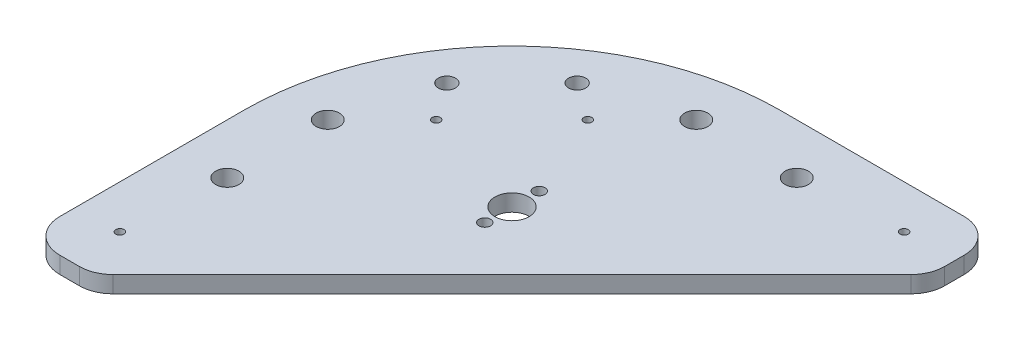
ISO-10303-21;
HEADER;
FILE_DESCRIPTION(('STEP AP214'),'2;1');
FILE_NAME('part.step','',(''),(''),'','','');
FILE_SCHEMA(('AUTOMOTIVE_DESIGN { 1 0 10303 214 1 1 1 1 }'));
ENDSEC;
DATA;
#1=APPLICATION_CONTEXT('core data for automotive mechanical design processes');
#2=APPLICATION_PROTOCOL_DEFINITION('international standard','automotive_design',2000,#1);
#3=PRODUCT_CONTEXT('',#1,'mechanical');
#4=PRODUCT('Part','Part','',(#3));
#5=PRODUCT_RELATED_PRODUCT_CATEGORY('part','',(#4));
#6=PRODUCT_DEFINITION_FORMATION('','',#4);
#7=PRODUCT_DEFINITION_CONTEXT('part definition',#1,'design');
#8=PRODUCT_DEFINITION('design','',#6,#7);
#9=PRODUCT_DEFINITION_SHAPE('','',#8);
#10=(LENGTH_UNIT() NAMED_UNIT(*) SI_UNIT(.MILLI.,.METRE.));
#11=(NAMED_UNIT(*) PLANE_ANGLE_UNIT() SI_UNIT($,.RADIAN.));
#12=(NAMED_UNIT(*) SI_UNIT($,.STERADIAN.) SOLID_ANGLE_UNIT());
#13=UNCERTAINTY_MEASURE_WITH_UNIT(LENGTH_MEASURE(1.E-05),#10,'distance_accuracy_value','');
#14=(GEOMETRIC_REPRESENTATION_CONTEXT(3) GLOBAL_UNCERTAINTY_ASSIGNED_CONTEXT((#13)) GLOBAL_UNIT_ASSIGNED_CONTEXT((#10,
#11,#12)) REPRESENTATION_CONTEXT('',''));
#15=CARTESIAN_POINT('',(0.,0.,0.));
#16=DIRECTION('',(0.,0.,1.));
#17=DIRECTION('',(1.,0.,0.));
#18=AXIS2_PLACEMENT_3D('',#15,#16,#17);
#19=CARTESIAN_POINT('',(92.0750000000001,3.175,92.075));
#20=DIRECTION('',(-1.,0.,0.));
#21=DIRECTION('',(0.,0.,1.));
#22=AXIS2_PLACEMENT_3D('',#19,#20,#21);
#23=PLANE('',#22);
#24=DIRECTION('',(0.,0.,-1.));
#25=VECTOR('',#24,1.);
#26=CARTESIAN_POINT('',(92.0750000000001,-3.175,92.075));
#27=LINE('',#26,#25);
#28=CARTESIAN_POINT('',(92.0750000000001,-3.175,-71.9355122421383));
#29=VERTEX_POINT('',#28);
#30=CARTESIAN_POINT('',(92.0750000000001,-3.175,-79.375));
#31=VERTEX_POINT('',#30);
#32=EDGE_CURVE('E137',#29,#31,#27,.T.);
#33=ORIENTED_EDGE('',*,*,#32,.T.);
#34=DIRECTION('',(0.,-1.,0.));
#35=VECTOR('',#34,1.);
#36=CARTESIAN_POINT('',(92.0750000000001,3.175,-79.3750000000001));
#37=LINE('',#36,#35);
#38=CARTESIAN_POINT('',(92.0750000000001,3.175,-79.375));
#39=VERTEX_POINT('',#38);
#40=EDGE_CURVE('E123',#31,#39,#37,.F.);
#41=ORIENTED_EDGE('',*,*,#40,.T.);
#42=DIRECTION('',(0.,0.,-1.));
#43=VECTOR('',#42,1.);
#44=CARTESIAN_POINT('',(92.0750000000001,3.175,92.075));
#45=LINE('',#44,#43);
#46=CARTESIAN_POINT('',(92.0750000000001,3.175,-71.9355122421383));
#47=VERTEX_POINT('',#46);
#48=EDGE_CURVE('E146',#47,#39,#45,.T.);
#49=ORIENTED_EDGE('',*,*,#48,.F.);
#50=DIRECTION('',(0.,1.,0.));
#51=VECTOR('',#50,1.);
#52=CARTESIAN_POINT('',(92.0750000000001,3.175,-71.9355122421383));
#53=LINE('',#52,#51);
#54=EDGE_CURVE('E126',#47,#29,#53,.F.);
#55=ORIENTED_EDGE('',*,*,#54,.T.);
#56=EDGE_LOOP('',(#33,#41,#49,#55));
#57=FACE_BOUND('',#56,.T.);
#58=ADVANCED_FACE('F39',(#57),#23,.F.);
#59=CARTESIAN_POINT('',(-92.0749999999999,3.175,-92.075));
#60=DIRECTION('',(0.,0.,1.));
#61=DIRECTION('',(1.,0.,0.));
#62=AXIS2_PLACEMENT_3D('',#59,#60,#61);
#63=PLANE('',#62);
#64=DIRECTION('',(-1.,0.,0.));
#65=VECTOR('',#64,1.);
#66=CARTESIAN_POINT('',(-92.0749999999999,-3.175,-92.075));
#67=LINE('',#66,#65);
#68=CARTESIAN_POINT('',(79.3750000000001,-3.175,-92.075));
#69=VERTEX_POINT('',#68);
#70=CARTESIAN_POINT('',(9.52500000000005,-3.175,-92.075));
#71=VERTEX_POINT('',#70);
#72=EDGE_CURVE('E130',#69,#71,#67,.T.);
#73=ORIENTED_EDGE('',*,*,#72,.T.);
#74=DIRECTION('',(0.,-1.,0.));
#75=VECTOR('',#74,1.);
#76=CARTESIAN_POINT('',(9.52500000000005,3.175,-92.075));
#77=LINE('',#76,#75);
#78=CARTESIAN_POINT('',(9.52500000000005,3.175,-92.075));
#79=VERTEX_POINT('',#78);
#80=EDGE_CURVE('E48',#71,#79,#77,.F.);
#81=ORIENTED_EDGE('',*,*,#80,.T.);
#82=DIRECTION('',(-1.,0.,0.));
#83=VECTOR('',#82,1.);
#84=CARTESIAN_POINT('',(-92.0749999999999,3.175,-92.075));
#85=LINE('',#84,#83);
#86=CARTESIAN_POINT('',(79.3750000000001,3.175,-92.075));
#87=VERTEX_POINT('',#86);
#88=EDGE_CURVE('E131',#87,#79,#85,.T.);
#89=ORIENTED_EDGE('',*,*,#88,.F.);
#90=DIRECTION('',(0.,-1.,0.));
#91=VECTOR('',#90,1.);
#92=CARTESIAN_POINT('',(79.3750000000001,3.175,-92.075));
#93=LINE('',#92,#91);
#94=EDGE_CURVE('E122',#87,#69,#93,.T.);
#95=ORIENTED_EDGE('',*,*,#94,.T.);
#96=EDGE_LOOP('',(#73,#81,#89,#95));
#97=FACE_BOUND('',#96,.T.);
#98=ADVANCED_FACE('F129',(#97),#63,.F.);
#99=CARTESIAN_POINT('',(-92.0749999999999,3.175,92.075));
#100=DIRECTION('',(1.,0.,0.));
#101=DIRECTION('',(0.,0.,-1.));
#102=AXIS2_PLACEMENT_3D('',#99,#100,#101);
#103=PLANE('',#102);
#104=DIRECTION('',(0.,0.,1.));
#105=VECTOR('',#104,1.);
#106=CARTESIAN_POINT('',(-92.0749999999999,3.175,92.075));
#107=LINE('',#106,#105);
#108=CARTESIAN_POINT('',(-92.0749999999999,3.175,9.52499999999996));
#109=VERTEX_POINT('',#108);
#110=CARTESIAN_POINT('',(-92.0749999999999,3.175,79.375));
#111=VERTEX_POINT('',#110);
#112=EDGE_CURVE('E254',#109,#111,#107,.T.);
#113=ORIENTED_EDGE('',*,*,#112,.F.);
#114=DIRECTION('',(0.,-1.,0.));
#115=VECTOR('',#114,1.);
#116=CARTESIAN_POINT('',(-92.0749999999999,3.175,9.52499999999996));
#117=LINE('',#116,#115);
#118=CARTESIAN_POINT('',(-92.0749999999999,-3.175,9.52499999999996));
#119=VERTEX_POINT('',#118);
#120=EDGE_CURVE('E177',#109,#119,#117,.T.);
#121=ORIENTED_EDGE('',*,*,#120,.T.);
#122=DIRECTION('',(0.,0.,1.));
#123=VECTOR('',#122,1.);
#124=CARTESIAN_POINT('',(-92.0749999999999,-3.175,92.075));
#125=LINE('',#124,#123);
#126=CARTESIAN_POINT('',(-92.0749999999999,-3.175,79.375));
#127=VERTEX_POINT('',#126);
#128=EDGE_CURVE('E136',#119,#127,#125,.T.);
#129=ORIENTED_EDGE('',*,*,#128,.T.);
#130=DIRECTION('',(0.,-1.,0.));
#131=VECTOR('',#130,1.);
#132=CARTESIAN_POINT('',(-92.0749999999999,3.175,79.375));
#133=LINE('',#132,#131);
#134=EDGE_CURVE('E174',#127,#111,#133,.F.);
#135=ORIENTED_EDGE('',*,*,#134,.T.);
#136=EDGE_LOOP('',(#113,#121,#129,#135));
#137=FACE_BOUND('',#136,.T.);
#138=ADVANCED_FACE('F288',(#137),#103,.F.);
#139=CARTESIAN_POINT('',(-92.0749999999999,3.175,92.075));
#140=DIRECTION('',(0.,0.,-1.));
#141=DIRECTION('',(-1.,0.,0.));
#142=AXIS2_PLACEMENT_3D('',#139,#140,#141);
#143=PLANE('',#142);
#144=DIRECTION('',(1.,0.,0.));
#145=VECTOR('',#144,1.);
#146=CARTESIAN_POINT('',(-92.0749999999999,-3.175,92.075));
#147=LINE('',#146,#145);
#148=CARTESIAN_POINT('',(-79.3749999999999,-3.175,92.075));
#149=VERTEX_POINT('',#148);
#150=CARTESIAN_POINT('',(-71.9355122421382,-3.175,92.075));
#151=VERTEX_POINT('',#150);
#152=EDGE_CURVE('E139',#149,#151,#147,.T.);
#153=ORIENTED_EDGE('',*,*,#152,.T.);
#154=DIRECTION('',(0.,1.,0.));
#155=VECTOR('',#154,1.);
#156=CARTESIAN_POINT('',(-71.9355122421382,3.175,92.075));
#157=LINE('',#156,#155);
#158=CARTESIAN_POINT('',(-71.9355122421382,3.175,92.075));
#159=VERTEX_POINT('',#158);
#160=EDGE_CURVE('E171',#151,#159,#157,.T.);
#161=ORIENTED_EDGE('',*,*,#160,.T.);
#162=DIRECTION('',(1.,0.,0.));
#163=VECTOR('',#162,1.);
#164=CARTESIAN_POINT('',(-92.0749999999999,3.175,92.075));
#165=LINE('',#164,#163);
#166=CARTESIAN_POINT('',(-79.3749999999999,3.175,92.075));
#167=VERTEX_POINT('',#166);
#168=EDGE_CURVE('E133',#167,#159,#165,.T.);
#169=ORIENTED_EDGE('',*,*,#168,.F.);
#170=DIRECTION('',(0.,-1.,0.));
#171=VECTOR('',#170,1.);
#172=CARTESIAN_POINT('',(-79.3749999999999,3.175,92.075));
#173=LINE('',#172,#171);
#174=EDGE_CURVE('E168',#167,#149,#173,.T.);
#175=ORIENTED_EDGE('',*,*,#174,.T.);
#176=EDGE_LOOP('',(#153,#161,#169,#175));
#177=FACE_BOUND('',#176,.T.);
#178=ADVANCED_FACE('F263',(#177),#143,.F.);
#179=CARTESIAN_POINT('',(0.,3.175,0.));
#180=DIRECTION('',(0.,-1.,0.));
#181=DIRECTION('',(0.,0.,-1.));
#182=AXIS2_PLACEMENT_3D('',#179,#180,#181);
#183=PLANE('',#182);
#184=CARTESIAN_POINT('',(-37.8139406810139,3.175,-62.5096450139542));
#185=DIRECTION('',(0.,-1.,0.));
#186=DIRECTION('',(0.,0.,-1.));
#187=AXIS2_PLACEMENT_3D('',#184,#185,#186);
#188=CIRCLE('',#187,3.2639);
#189=CARTESIAN_POINT('',(-37.8139406810139,3.175,-65.7735450139542));
#190=VERTEX_POINT('',#189);
#191=EDGE_CURVE('E376',#190,#190,#188,.T.);
#192=ORIENTED_EDGE('',*,*,#191,.T.);
#193=EDGE_LOOP('',(#192));
#194=FACE_BOUND('',#193,.T.);
#195=CARTESIAN_POINT('',(-62.509645013954,3.175,-37.813940681014));
#196=DIRECTION('',(0.,-1.,0.));
#197=DIRECTION('',(0.,0.,-1.));
#198=AXIS2_PLACEMENT_3D('',#195,#196,#197);
#199=CIRCLE('',#198,3.2639);
#200=CARTESIAN_POINT('',(-62.509645013954,3.175,-41.077840681014));
#201=VERTEX_POINT('',#200);
#202=EDGE_CURVE('E384',#201,#201,#199,.T.);
#203=ORIENTED_EDGE('',*,*,#202,.T.);
#204=EDGE_LOOP('',(#203));
#205=FACE_BOUND('',#204,.T.);
#206=CARTESIAN_POINT('',(-75.6552561210691,3.175,73.025));
#207=DIRECTION('',(0.,-1.,0.));
#208=DIRECTION('',(0.,0.,-1.));
#209=AXIS2_PLACEMENT_3D('',#206,#207,#208);
#210=CIRCLE('',#209,1.53670000000001);
#211=CARTESIAN_POINT('',(-75.6552561210691,3.175,71.4883));
#212=VERTEX_POINT('',#211);
#213=EDGE_CURVE('E190',#212,#212,#210,.T.);
#214=ORIENTED_EDGE('',*,*,#213,.T.);
#215=EDGE_LOOP('',(#214));
#216=FACE_BOUND('',#215,.T.);
#217=CARTESIAN_POINT('',(-52.4684097937106,3.175,-23.7315902062894));
#218=DIRECTION('',(0.,-1.,0.));
#219=DIRECTION('',(0.,0.,-1.));
#220=AXIS2_PLACEMENT_3D('',#217,#218,#219);
#221=CIRCLE('',#220,1.53670000000001);
#222=CARTESIAN_POINT('',(-52.4684097937106,3.175,-25.2682902062894));
#223=VERTEX_POINT('',#222);
#224=EDGE_CURVE('E390',#223,#223,#221,.T.);
#225=ORIENTED_EDGE('',*,*,#224,.T.);
#226=EDGE_LOOP('',(#225));
#227=FACE_BOUND('',#226,.T.);
#228=CARTESIAN_POINT('',(73.0250000000001,3.175,-75.6552561210691));
#229=DIRECTION('',(0.,-1.,0.));
#230=DIRECTION('',(0.,0.,-1.));
#231=AXIS2_PLACEMENT_3D('',#228,#229,#230);
#232=CIRCLE('',#231,1.53670000000001);
#233=CARTESIAN_POINT('',(73.0250000000001,3.175,-77.1919561210691));
#234=VERTEX_POINT('',#233);
#235=EDGE_CURVE('E203',#234,#234,#232,.T.);
#236=ORIENTED_EDGE('',*,*,#235,.T.);
#237=EDGE_LOOP('',(#236));
#238=FACE_BOUND('',#237,.T.);
#239=CARTESIAN_POINT('',(-23.7315902062893,3.175,-52.4684097937107));
#240=DIRECTION('',(0.,-1.,0.));
#241=DIRECTION('',(0.,0.,-1.));
#242=AXIS2_PLACEMENT_3D('',#239,#240,#241);
#243=CIRCLE('',#242,1.5367);
#244=CARTESIAN_POINT('',(-23.7315902062893,3.175,-54.0051097937107));
#245=VERTEX_POINT('',#244);
#246=EDGE_CURVE('E186',#245,#245,#243,.T.);
#247=ORIENTED_EDGE('',*,*,#246,.T.);
#248=EDGE_LOOP('',(#247));
#249=FACE_BOUND('',#248,.T.);
#250=CARTESIAN_POINT('',(-3.17499999999994,3.175,-73.0250000000001));
#251=DIRECTION('',(0.,1.,0.));
#252=DIRECTION('',(0.,0.,1.));
#253=AXIS2_PLACEMENT_3D('',#250,#251,#252);
#254=CIRCLE('',#253,4.4196);
#255=CARTESIAN_POINT('',(-3.17499999999994,3.175,-68.6054000000001));
#256=VERTEX_POINT('',#255);
#257=EDGE_CURVE('E185',#256,#256,#254,.T.);
#258=ORIENTED_EDGE('',*,*,#257,.F.);
#259=EDGE_LOOP('',(#258));
#260=FACE_BOUND('',#259,.T.);
#261=CARTESIAN_POINT('',(34.9250000000001,3.175,-73.0250000000001));
#262=DIRECTION('',(0.,1.,0.));
#263=DIRECTION('',(0.,0.,1.));
#264=AXIS2_PLACEMENT_3D('',#261,#262,#263);
#265=CIRCLE('',#264,4.4196);
#266=CARTESIAN_POINT('',(34.9250000000001,3.175,-68.6054000000001));
#267=VERTEX_POINT('',#266);
#268=EDGE_CURVE('E210',#267,#267,#265,.T.);
#269=ORIENTED_EDGE('',*,*,#268,.F.);
#270=EDGE_LOOP('',(#269));
#271=FACE_BOUND('',#270,.T.);
#272=CARTESIAN_POINT('',(-73.0249999999999,3.175,-3.17500000000001));
#273=DIRECTION('',(0.,1.,0.));
#274=DIRECTION('',(0.,0.,1.));
#275=AXIS2_PLACEMENT_3D('',#272,#273,#274);
#276=CIRCLE('',#275,4.4196);
#277=CARTESIAN_POINT('',(-73.0249999999999,3.175,1.24459999999998));
#278=VERTEX_POINT('',#277);
#279=EDGE_CURVE('E216',#278,#278,#276,.T.);
#280=ORIENTED_EDGE('',*,*,#279,.F.);
#281=EDGE_LOOP('',(#280));
#282=FACE_BOUND('',#281,.T.);
#283=CARTESIAN_POINT('',(-73.0249999999999,3.175,34.925));
#284=DIRECTION('',(0.,1.,0.));
#285=DIRECTION('',(0.,0.,1.));
#286=AXIS2_PLACEMENT_3D('',#283,#284,#285);
#287=CIRCLE('',#286,4.4196);
#288=CARTESIAN_POINT('',(-73.0249999999999,3.175,39.3446));
#289=VERTEX_POINT('',#288);
#290=EDGE_CURVE('E222',#289,#289,#287,.T.);
#291=ORIENTED_EDGE('',*,*,#290,.F.);
#292=EDGE_LOOP('',(#291));
#293=FACE_BOUND('',#292,.T.);
#294=CARTESIAN_POINT('',(-9.52499999999994,3.175,-19.84375));
#295=DIRECTION('',(0.,1.,0.));
#296=DIRECTION('',(0.,0.,1.));
#297=AXIS2_PLACEMENT_3D('',#294,#295,#296);
#298=CIRCLE('',#297,2.20345);
#299=CARTESIAN_POINT('',(-9.52499999999994,3.175,-17.6403));
#300=VERTEX_POINT('',#299);
#301=EDGE_CURVE('E233',#300,#300,#298,.T.);
#302=ORIENTED_EDGE('',*,*,#301,.F.);
#303=EDGE_LOOP('',(#302));
#304=FACE_BOUND('',#303,.T.);
#305=CARTESIAN_POINT('',(-9.52499999999993,3.175,0.793749999999996));
#306=DIRECTION('',(0.,1.,0.));
#307=DIRECTION('',(0.,0.,1.));
#308=AXIS2_PLACEMENT_3D('',#305,#306,#307);
#309=CIRCLE('',#308,2.20345);
#310=CARTESIAN_POINT('',(-9.52499999999993,3.175,2.99719999999999));
#311=VERTEX_POINT('',#310);
#312=EDGE_CURVE('E228',#311,#311,#309,.T.);
#313=ORIENTED_EDGE('',*,*,#312,.F.);
#314=EDGE_LOOP('',(#313));
#315=FACE_BOUND('',#314,.T.);
#316=CARTESIAN_POINT('',(-9.52499999999994,3.175,-9.52500000000001));
#317=DIRECTION('',(0.,1.,0.));
#318=DIRECTION('',(0.,0.,1.));
#319=AXIS2_PLACEMENT_3D('',#316,#317,#318);
#320=CIRCLE('',#319,6.477);
#321=CARTESIAN_POINT('',(-9.52499999999994,3.175,-3.04800000000001));
#322=VERTEX_POINT('',#321);
#323=EDGE_CURVE('E232',#322,#322,#320,.T.);
#324=ORIENTED_EDGE('',*,*,#323,.F.);
#325=EDGE_LOOP('',(#324));
#326=FACE_BOUND('',#325,.T.);
#327=ORIENTED_EDGE('',*,*,#88,.T.);
#328=CARTESIAN_POINT('',(9.52500000000006,3.175,9.52499999999996));
#329=DIRECTION('',(0.,-1.,0.));
#330=DIRECTION('',(0.,0.,-1.));
#331=AXIS2_PLACEMENT_3D('',#328,#329,#330);
#332=CIRCLE('',#331,101.6);
#333=EDGE_CURVE('E11',#79,#109,#332,.F.);
#334=ORIENTED_EDGE('',*,*,#333,.T.);
#335=ORIENTED_EDGE('',*,*,#112,.T.);
#336=CARTESIAN_POINT('',(-79.3749999999999,3.175,79.375));
#337=DIRECTION('',(0.,-1.,0.));
#338=DIRECTION('',(0.,0.,-1.));
#339=AXIS2_PLACEMENT_3D('',#336,#337,#338);
#340=CIRCLE('',#339,12.7);
#341=EDGE_CURVE('E155',#111,#167,#340,.F.);
#342=ORIENTED_EDGE('',*,*,#341,.T.);
#343=ORIENTED_EDGE('',*,*,#168,.T.);
#344=CARTESIAN_POINT('',(-71.9355122421382,3.175,79.375));
#345=DIRECTION('',(0.,-1.,0.));
#346=DIRECTION('',(0.,0.,-1.));
#347=AXIS2_PLACEMENT_3D('',#344,#345,#346);
#348=CIRCLE('',#347,12.7);
#349=CARTESIAN_POINT('',(-62.955256121069,3.175,88.3552561210691));
#350=VERTEX_POINT('',#349);
#351=EDGE_CURVE('E157',#159,#350,#348,.F.);
#352=ORIENTED_EDGE('',*,*,#351,.T.);
#353=DIRECTION('',(-0.707106781186547,0.,0.707106781186547));
#354=VECTOR('',#353,1.);
#355=CARTESIAN_POINT('',(92.0750000000001,3.175,-66.675));
#356=LINE('',#355,#354);
#357=CARTESIAN_POINT('',(88.3552561210692,3.175,-62.9552561210692));
#358=VERTEX_POINT('',#357);
#359=EDGE_CURVE('E244',#358,#350,#356,.T.);
#360=ORIENTED_EDGE('',*,*,#359,.F.);
#361=CARTESIAN_POINT('',(79.3750000000001,3.175,-71.9355122421383));
#362=DIRECTION('',(0.,-1.,0.));
#363=DIRECTION('',(0.,0.,-1.));
#364=AXIS2_PLACEMENT_3D('',#361,#362,#363);
#365=CIRCLE('',#364,12.7);
#366=EDGE_CURVE('E159',#358,#47,#365,.F.);
#367=ORIENTED_EDGE('',*,*,#366,.T.);
#368=ORIENTED_EDGE('',*,*,#48,.T.);
#369=CARTESIAN_POINT('',(79.3750000000001,3.175,-79.375));
#370=DIRECTION('',(0.,-1.,0.));
#371=DIRECTION('',(0.,0.,-1.));
#372=AXIS2_PLACEMENT_3D('',#369,#370,#371);
#373=CIRCLE('',#372,12.7);
#374=EDGE_CURVE('E161',#39,#87,#373,.F.);
#375=ORIENTED_EDGE('',*,*,#374,.T.);
#376=EDGE_LOOP('',(#327,#334,#335,#342,#343,#352,#360,#367,#368,#375));
#377=FACE_BOUND('',#376,.T.);
#378=ADVANCED_FACE('F258',(#194,#205,#216,#227,#238,#249,#260,#271,#282,#293,#304,#315,#326,
#377),#183,.F.);
#379=CARTESIAN_POINT('',(0.,-3.175,0.));
#380=DIRECTION('',(0.,-1.,0.));
#381=DIRECTION('',(0.,0.,-1.));
#382=AXIS2_PLACEMENT_3D('',#379,#380,#381);
#383=PLANE('',#382);
#384=CARTESIAN_POINT('',(-37.8139406810139,-3.175,-62.5096450139542));
#385=DIRECTION('',(0.,-1.,0.));
#386=DIRECTION('',(0.,0.,-1.));
#387=AXIS2_PLACEMENT_3D('',#384,#385,#386);
#388=CIRCLE('',#387,3.2639);
#389=CARTESIAN_POINT('',(-37.8139406810139,-3.175,-65.7735450139542));
#390=VERTEX_POINT('',#389);
#391=EDGE_CURVE('E379',#390,#390,#388,.T.);
#392=ORIENTED_EDGE('',*,*,#391,.F.);
#393=EDGE_LOOP('',(#392));
#394=FACE_BOUND('',#393,.T.);
#395=CARTESIAN_POINT('',(-62.509645013954,-3.175,-37.813940681014));
#396=DIRECTION('',(0.,-1.,0.));
#397=DIRECTION('',(0.,0.,-1.));
#398=AXIS2_PLACEMENT_3D('',#395,#396,#397);
#399=CIRCLE('',#398,3.2639);
#400=CARTESIAN_POINT('',(-62.509645013954,-3.175,-41.077840681014));
#401=VERTEX_POINT('',#400);
#402=EDGE_CURVE('E381',#401,#401,#399,.T.);
#403=ORIENTED_EDGE('',*,*,#402,.F.);
#404=EDGE_LOOP('',(#403));
#405=FACE_BOUND('',#404,.T.);
#406=CARTESIAN_POINT('',(-75.6552561210691,-3.175,73.025));
#407=DIRECTION('',(0.,-1.,0.));
#408=DIRECTION('',(0.,0.,-1.));
#409=AXIS2_PLACEMENT_3D('',#406,#407,#408);
#410=CIRCLE('',#409,1.53670000000001);
#411=CARTESIAN_POINT('',(-75.6552561210691,-3.175,71.4883));
#412=VERTEX_POINT('',#411);
#413=EDGE_CURVE('E43',#412,#412,#410,.T.);
#414=ORIENTED_EDGE('',*,*,#413,.F.);
#415=EDGE_LOOP('',(#414));
#416=FACE_BOUND('',#415,.T.);
#417=CARTESIAN_POINT('',(-52.4684097937106,-3.175,-23.7315902062894));
#418=DIRECTION('',(0.,-1.,0.));
#419=DIRECTION('',(0.,0.,-1.));
#420=AXIS2_PLACEMENT_3D('',#417,#418,#419);
#421=CIRCLE('',#420,1.53670000000001);
#422=CARTESIAN_POINT('',(-52.4684097937106,-3.175,-25.2682902062894));
#423=VERTEX_POINT('',#422);
#424=EDGE_CURVE('E189',#423,#423,#421,.T.);
#425=ORIENTED_EDGE('',*,*,#424,.F.);
#426=EDGE_LOOP('',(#425));
#427=FACE_BOUND('',#426,.T.);
#428=CARTESIAN_POINT('',(73.0250000000001,-3.175,-75.6552561210691));
#429=DIRECTION('',(0.,-1.,0.));
#430=DIRECTION('',(0.,0.,-1.));
#431=AXIS2_PLACEMENT_3D('',#428,#429,#430);
#432=CIRCLE('',#431,1.53670000000001);
#433=CARTESIAN_POINT('',(73.0250000000001,-3.175,-77.1919561210691));
#434=VERTEX_POINT('',#433);
#435=EDGE_CURVE('E187',#434,#434,#432,.T.);
#436=ORIENTED_EDGE('',*,*,#435,.F.);
#437=EDGE_LOOP('',(#436));
#438=FACE_BOUND('',#437,.T.);
#439=CARTESIAN_POINT('',(-23.7315902062893,-3.175,-52.4684097937107));
#440=DIRECTION('',(0.,-1.,0.));
#441=DIRECTION('',(0.,0.,-1.));
#442=AXIS2_PLACEMENT_3D('',#439,#440,#441);
#443=CIRCLE('',#442,1.5367);
#444=CARTESIAN_POINT('',(-23.7315902062893,-3.175,-54.0051097937107));
#445=VERTEX_POINT('',#444);
#446=EDGE_CURVE('E182',#445,#445,#443,.T.);
#447=ORIENTED_EDGE('',*,*,#446,.F.);
#448=EDGE_LOOP('',(#447));
#449=FACE_BOUND('',#448,.T.);
#450=CARTESIAN_POINT('',(-3.17499999999994,-3.175,-73.0250000000001));
#451=DIRECTION('',(0.,1.,0.));
#452=DIRECTION('',(0.,0.,1.));
#453=AXIS2_PLACEMENT_3D('',#450,#451,#452);
#454=CIRCLE('',#453,4.4196);
#455=CARTESIAN_POINT('',(-3.17499999999994,-3.175,-68.6054000000001));
#456=VERTEX_POINT('',#455);
#457=EDGE_CURVE('E207',#456,#456,#454,.T.);
#458=ORIENTED_EDGE('',*,*,#457,.T.);
#459=EDGE_LOOP('',(#458));
#460=FACE_BOUND('',#459,.T.);
#461=CARTESIAN_POINT('',(34.9250000000001,-3.175,-73.0250000000001));
#462=DIRECTION('',(0.,1.,0.));
#463=DIRECTION('',(0.,0.,1.));
#464=AXIS2_PLACEMENT_3D('',#461,#462,#463);
#465=CIRCLE('',#464,4.4196);
#466=CARTESIAN_POINT('',(34.9250000000001,-3.175,-68.6054000000001));
#467=VERTEX_POINT('',#466);
#468=EDGE_CURVE('E213',#467,#467,#465,.T.);
#469=ORIENTED_EDGE('',*,*,#468,.T.);
#470=EDGE_LOOP('',(#469));
#471=FACE_BOUND('',#470,.T.);
#472=CARTESIAN_POINT('',(-73.0249999999999,-3.175,-3.17500000000001));
#473=DIRECTION('',(0.,1.,0.));
#474=DIRECTION('',(0.,0.,1.));
#475=AXIS2_PLACEMENT_3D('',#472,#473,#474);
#476=CIRCLE('',#475,4.4196);
#477=CARTESIAN_POINT('',(-73.0249999999999,-3.175,1.24459999999998));
#478=VERTEX_POINT('',#477);
#479=EDGE_CURVE('E219',#478,#478,#476,.T.);
#480=ORIENTED_EDGE('',*,*,#479,.T.);
#481=EDGE_LOOP('',(#480));
#482=FACE_BOUND('',#481,.T.);
#483=CARTESIAN_POINT('',(-73.0249999999999,-3.175,34.925));
#484=DIRECTION('',(0.,1.,0.));
#485=DIRECTION('',(0.,0.,1.));
#486=AXIS2_PLACEMENT_3D('',#483,#484,#485);
#487=CIRCLE('',#486,4.4196);
#488=CARTESIAN_POINT('',(-73.0249999999999,-3.175,39.3446));
#489=VERTEX_POINT('',#488);
#490=EDGE_CURVE('E225',#489,#489,#487,.T.);
#491=ORIENTED_EDGE('',*,*,#490,.T.);
#492=EDGE_LOOP('',(#491));
#493=FACE_BOUND('',#492,.T.);
#494=CARTESIAN_POINT('',(-9.52499999999994,-3.175,-19.84375));
#495=DIRECTION('',(0.,1.,0.));
#496=DIRECTION('',(0.,0.,1.));
#497=AXIS2_PLACEMENT_3D('',#494,#495,#496);
#498=CIRCLE('',#497,2.20345);
#499=CARTESIAN_POINT('',(-9.52499999999994,-3.175,-17.6403));
#500=VERTEX_POINT('',#499);
#501=EDGE_CURVE('E229',#500,#500,#498,.T.);
#502=ORIENTED_EDGE('',*,*,#501,.T.);
#503=EDGE_LOOP('',(#502));
#504=FACE_BOUND('',#503,.T.);
#505=CARTESIAN_POINT('',(-9.52499999999993,-3.175,0.793749999999996));
#506=DIRECTION('',(0.,1.,0.));
#507=DIRECTION('',(0.,0.,1.));
#508=AXIS2_PLACEMENT_3D('',#505,#506,#507);
#509=CIRCLE('',#508,2.20345);
#510=CARTESIAN_POINT('',(-9.52499999999993,-3.175,2.99719999999999));
#511=VERTEX_POINT('',#510);
#512=EDGE_CURVE('E236',#511,#511,#509,.T.);
#513=ORIENTED_EDGE('',*,*,#512,.T.);
#514=EDGE_LOOP('',(#513));
#515=FACE_BOUND('',#514,.T.);
#516=CARTESIAN_POINT('',(-9.52499999999994,-3.175,-9.52500000000001));
#517=DIRECTION('',(0.,1.,0.));
#518=DIRECTION('',(0.,0.,1.));
#519=AXIS2_PLACEMENT_3D('',#516,#517,#518);
#520=CIRCLE('',#519,6.477);
#521=CARTESIAN_POINT('',(-9.52499999999994,-3.175,-3.04800000000001));
#522=VERTEX_POINT('',#521);
#523=EDGE_CURVE('E241',#522,#522,#520,.T.);
#524=ORIENTED_EDGE('',*,*,#523,.T.);
#525=EDGE_LOOP('',(#524));
#526=FACE_BOUND('',#525,.T.);
#527=ORIENTED_EDGE('',*,*,#128,.F.);
#528=CARTESIAN_POINT('',(9.52500000000006,-3.175,9.52499999999996));
#529=DIRECTION('',(0.,-1.,0.));
#530=DIRECTION('',(0.,0.,-1.));
#531=AXIS2_PLACEMENT_3D('',#528,#529,#530);
#532=CIRCLE('',#531,101.6);
#533=EDGE_CURVE('E63',#119,#71,#532,.T.);
#534=ORIENTED_EDGE('',*,*,#533,.T.);
#535=ORIENTED_EDGE('',*,*,#72,.F.);
#536=CARTESIAN_POINT('',(79.3750000000001,-3.175,-79.375));
#537=DIRECTION('',(0.,-1.,0.));
#538=DIRECTION('',(0.,0.,-1.));
#539=AXIS2_PLACEMENT_3D('',#536,#537,#538);
#540=CIRCLE('',#539,12.7);
#541=EDGE_CURVE('E118',#69,#31,#540,.T.);
#542=ORIENTED_EDGE('',*,*,#541,.T.);
#543=ORIENTED_EDGE('',*,*,#32,.F.);
#544=CARTESIAN_POINT('',(79.3750000000001,-3.175,-71.9355122421383));
#545=DIRECTION('',(0.,-1.,0.));
#546=DIRECTION('',(0.,0.,-1.));
#547=AXIS2_PLACEMENT_3D('',#544,#545,#546);
#548=CIRCLE('',#547,12.7);
#549=CARTESIAN_POINT('',(88.3552561210692,-3.175,-62.9552561210692));
#550=VERTEX_POINT('',#549);
#551=EDGE_CURVE('E127',#29,#550,#548,.T.);
#552=ORIENTED_EDGE('',*,*,#551,.T.);
#553=DIRECTION('',(-0.707106781186547,0.,0.707106781186547));
#554=VECTOR('',#553,1.);
#555=CARTESIAN_POINT('',(92.0750000000001,-3.175,-66.675));
#556=LINE('',#555,#554);
#557=CARTESIAN_POINT('',(-62.955256121069,-3.175,88.3552561210691));
#558=VERTEX_POINT('',#557);
#559=EDGE_CURVE('E141',#550,#558,#556,.T.);
#560=ORIENTED_EDGE('',*,*,#559,.T.);
#561=CARTESIAN_POINT('',(-71.9355122421382,-3.175,79.375));
#562=DIRECTION('',(0.,-1.,0.));
#563=DIRECTION('',(0.,0.,-1.));
#564=AXIS2_PLACEMENT_3D('',#561,#562,#563);
#565=CIRCLE('',#564,12.7);
#566=EDGE_CURVE('E150',#558,#151,#565,.T.);
#567=ORIENTED_EDGE('',*,*,#566,.T.);
#568=ORIENTED_EDGE('',*,*,#152,.F.);
#569=CARTESIAN_POINT('',(-79.3749999999999,-3.175,79.375));
#570=DIRECTION('',(0.,-1.,0.));
#571=DIRECTION('',(0.,0.,-1.));
#572=AXIS2_PLACEMENT_3D('',#569,#570,#571);
#573=CIRCLE('',#572,12.7);
#574=EDGE_CURVE('E132',#149,#127,#573,.T.);
#575=ORIENTED_EDGE('',*,*,#574,.T.);
#576=EDGE_LOOP('',(#527,#534,#535,#542,#543,#552,#560,#567,#568,#575));
#577=FACE_BOUND('',#576,.T.);
#578=ADVANCED_FACE('F135',(#394,#405,#416,#427,#438,#449,#460,#471,#482,#493,#504,#515,#526,
#577),#383,.T.);
#579=CARTESIAN_POINT('',(92.0750000000001,-3.175,-66.675));
#580=DIRECTION('',(-0.707106781186548,0.,-0.707106781186548));
#581=DIRECTION('',(-0.707106781186548,0.,0.707106781186548));
#582=AXIS2_PLACEMENT_3D('',#579,#580,#581);
#583=PLANE('',#582);
#584=ORIENTED_EDGE('',*,*,#559,.F.);
#585=DIRECTION('',(0.,1.,0.));
#586=VECTOR('',#585,1.);
#587=CARTESIAN_POINT('',(88.3552561210692,-3.175,-62.9552561210692));
#588=LINE('',#587,#586);
#589=EDGE_CURVE('E165',#550,#358,#588,.T.);
#590=ORIENTED_EDGE('',*,*,#589,.T.);
#591=ORIENTED_EDGE('',*,*,#359,.T.);
#592=DIRECTION('',(0.,1.,0.));
#593=VECTOR('',#592,1.);
#594=CARTESIAN_POINT('',(-62.9552561210691,-3.175,88.3552561210691));
#595=LINE('',#594,#593);
#596=EDGE_CURVE('E163',#350,#558,#595,.F.);
#597=ORIENTED_EDGE('',*,*,#596,.T.);
#598=EDGE_LOOP('',(#584,#590,#591,#597));
#599=FACE_BOUND('',#598,.T.);
#600=ADVANCED_FACE('F275',(#599),#583,.F.);
#601=CARTESIAN_POINT('',(-9.52499999999994,-3.175,-9.52500000000001));
#602=DIRECTION('',(0.,1.,0.));
#603=DIRECTION('',(0.,0.,1.));
#604=AXIS2_PLACEMENT_3D('',#601,#602,#603);
#605=CYLINDRICAL_SURFACE('',#604,6.477);
#606=ORIENTED_EDGE('',*,*,#523,.F.);
#607=EDGE_LOOP('',(#606));
#608=FACE_BOUND('',#607,.T.);
#609=ORIENTED_EDGE('',*,*,#323,.T.);
#610=EDGE_LOOP('',(#609));
#611=FACE_BOUND('',#610,.T.);
#612=ADVANCED_FACE('F328',(#608,#611),#605,.F.);
#613=CARTESIAN_POINT('',(-9.52499999999993,-3.175,0.793749999999996));
#614=DIRECTION('',(0.,1.,0.));
#615=DIRECTION('',(0.,0.,1.));
#616=AXIS2_PLACEMENT_3D('',#613,#614,#615);
#617=CYLINDRICAL_SURFACE('',#616,2.20345);
#618=ORIENTED_EDGE('',*,*,#512,.F.);
#619=EDGE_LOOP('',(#618));
#620=FACE_BOUND('',#619,.T.);
#621=ORIENTED_EDGE('',*,*,#312,.T.);
#622=EDGE_LOOP('',(#621));
#623=FACE_BOUND('',#622,.T.);
#624=ADVANCED_FACE('F331',(#620,#623),#617,.F.);
#625=CARTESIAN_POINT('',(-9.52499999999994,-3.175,-19.84375));
#626=DIRECTION('',(0.,1.,0.));
#627=DIRECTION('',(0.,0.,1.));
#628=AXIS2_PLACEMENT_3D('',#625,#626,#627);
#629=CYLINDRICAL_SURFACE('',#628,2.20345);
#630=ORIENTED_EDGE('',*,*,#501,.F.);
#631=EDGE_LOOP('',(#630));
#632=FACE_BOUND('',#631,.T.);
#633=ORIENTED_EDGE('',*,*,#301,.T.);
#634=EDGE_LOOP('',(#633));
#635=FACE_BOUND('',#634,.T.);
#636=ADVANCED_FACE('F335',(#632,#635),#629,.F.);
#637=CARTESIAN_POINT('',(-73.0249999999999,3.175,34.925));
#638=DIRECTION('',(0.,1.,0.));
#639=DIRECTION('',(0.,0.,1.));
#640=AXIS2_PLACEMENT_3D('',#637,#638,#639);
#641=CYLINDRICAL_SURFACE('',#640,4.4196);
#642=ORIENTED_EDGE('',*,*,#490,.F.);
#643=EDGE_LOOP('',(#642));
#644=FACE_BOUND('',#643,.T.);
#645=ORIENTED_EDGE('',*,*,#290,.T.);
#646=EDGE_LOOP('',(#645));
#647=FACE_BOUND('',#646,.T.);
#648=ADVANCED_FACE('F339',(#644,#647),#641,.F.);
#649=CARTESIAN_POINT('',(-73.0249999999999,3.175,-3.17500000000001));
#650=DIRECTION('',(0.,1.,0.));
#651=DIRECTION('',(0.,0.,1.));
#652=AXIS2_PLACEMENT_3D('',#649,#650,#651);
#653=CYLINDRICAL_SURFACE('',#652,4.4196);
#654=ORIENTED_EDGE('',*,*,#479,.F.);
#655=EDGE_LOOP('',(#654));
#656=FACE_BOUND('',#655,.T.);
#657=ORIENTED_EDGE('',*,*,#279,.T.);
#658=EDGE_LOOP('',(#657));
#659=FACE_BOUND('',#658,.T.);
#660=ADVANCED_FACE('F343',(#656,#659),#653,.F.);
#661=CARTESIAN_POINT('',(34.9250000000001,3.175,-73.0250000000001));
#662=DIRECTION('',(0.,1.,0.));
#663=DIRECTION('',(0.,0.,1.));
#664=AXIS2_PLACEMENT_3D('',#661,#662,#663);
#665=CYLINDRICAL_SURFACE('',#664,4.4196);
#666=ORIENTED_EDGE('',*,*,#468,.F.);
#667=EDGE_LOOP('',(#666));
#668=FACE_BOUND('',#667,.T.);
#669=ORIENTED_EDGE('',*,*,#268,.T.);
#670=EDGE_LOOP('',(#669));
#671=FACE_BOUND('',#670,.T.);
#672=ADVANCED_FACE('F347',(#668,#671),#665,.F.);
#673=CARTESIAN_POINT('',(-3.17499999999994,3.175,-73.0250000000001));
#674=DIRECTION('',(0.,1.,0.));
#675=DIRECTION('',(0.,0.,1.));
#676=AXIS2_PLACEMENT_3D('',#673,#674,#675);
#677=CYLINDRICAL_SURFACE('',#676,4.4196);
#678=ORIENTED_EDGE('',*,*,#457,.F.);
#679=EDGE_LOOP('',(#678));
#680=FACE_BOUND('',#679,.T.);
#681=ORIENTED_EDGE('',*,*,#257,.T.);
#682=EDGE_LOOP('',(#681));
#683=FACE_BOUND('',#682,.T.);
#684=ADVANCED_FACE('F294',(#680,#683),#677,.F.);
#685=CARTESIAN_POINT('',(79.3750000000001,3.175,-79.375));
#686=DIRECTION('',(0.,-1.,0.));
#687=DIRECTION('',(0.,0.,-1.));
#688=AXIS2_PLACEMENT_3D('',#685,#686,#687);
#689=CYLINDRICAL_SURFACE('',#688,12.7);
#690=ORIENTED_EDGE('',*,*,#374,.F.);
#691=ORIENTED_EDGE('',*,*,#40,.F.);
#692=ORIENTED_EDGE('',*,*,#541,.F.);
#693=ORIENTED_EDGE('',*,*,#94,.F.);
#694=EDGE_LOOP('',(#690,#691,#692,#693));
#695=FACE_BOUND('',#694,.T.);
#696=ADVANCED_FACE('F121',(#695),#689,.T.);
#697=CARTESIAN_POINT('',(79.3750000000001,-3.175,-71.9355122421383));
#698=DIRECTION('',(0.,1.,0.));
#699=DIRECTION('',(0.,0.,1.));
#700=AXIS2_PLACEMENT_3D('',#697,#698,#699);
#701=CYLINDRICAL_SURFACE('',#700,12.7);
#702=ORIENTED_EDGE('',*,*,#551,.F.);
#703=ORIENTED_EDGE('',*,*,#54,.F.);
#704=ORIENTED_EDGE('',*,*,#366,.F.);
#705=ORIENTED_EDGE('',*,*,#589,.F.);
#706=EDGE_LOOP('',(#702,#703,#704,#705));
#707=FACE_BOUND('',#706,.T.);
#708=ADVANCED_FACE('F280',(#707),#701,.T.);
#709=CARTESIAN_POINT('',(-71.9355122421382,3.175,79.375));
#710=DIRECTION('',(0.,1.,0.));
#711=DIRECTION('',(0.,0.,1.));
#712=AXIS2_PLACEMENT_3D('',#709,#710,#711);
#713=CYLINDRICAL_SURFACE('',#712,12.7);
#714=ORIENTED_EDGE('',*,*,#566,.F.);
#715=ORIENTED_EDGE('',*,*,#596,.F.);
#716=ORIENTED_EDGE('',*,*,#351,.F.);
#717=ORIENTED_EDGE('',*,*,#160,.F.);
#718=EDGE_LOOP('',(#714,#715,#716,#717));
#719=FACE_BOUND('',#718,.T.);
#720=ADVANCED_FACE('F271',(#719),#713,.T.);
#721=CARTESIAN_POINT('',(-79.3749999999999,3.175,79.375));
#722=DIRECTION('',(0.,-1.,0.));
#723=DIRECTION('',(0.,0.,-1.));
#724=AXIS2_PLACEMENT_3D('',#721,#722,#723);
#725=CYLINDRICAL_SURFACE('',#724,12.7);
#726=ORIENTED_EDGE('',*,*,#341,.F.);
#727=ORIENTED_EDGE('',*,*,#134,.F.);
#728=ORIENTED_EDGE('',*,*,#574,.F.);
#729=ORIENTED_EDGE('',*,*,#174,.F.);
#730=EDGE_LOOP('',(#726,#727,#728,#729));
#731=FACE_BOUND('',#730,.T.);
#732=ADVANCED_FACE('F267',(#731),#725,.T.);
#733=CARTESIAN_POINT('',(9.52500000000006,3.175,9.52499999999996));
#734=DIRECTION('',(0.,-1.,0.));
#735=DIRECTION('',(0.,0.,-1.));
#736=AXIS2_PLACEMENT_3D('',#733,#734,#735);
#737=CYLINDRICAL_SURFACE('',#736,101.6);
#738=ORIENTED_EDGE('',*,*,#333,.F.);
#739=ORIENTED_EDGE('',*,*,#80,.F.);
#740=ORIENTED_EDGE('',*,*,#533,.F.);
#741=ORIENTED_EDGE('',*,*,#120,.F.);
#742=EDGE_LOOP('',(#738,#739,#740,#741));
#743=FACE_BOUND('',#742,.T.);
#744=ADVANCED_FACE('F41',(#743),#737,.T.);
#745=CARTESIAN_POINT('',(-23.7315902062893,3.175,-52.4684097937107));
#746=DIRECTION('',(0.,-1.,0.));
#747=DIRECTION('',(0.,0.,-1.));
#748=AXIS2_PLACEMENT_3D('',#745,#746,#747);
#749=CYLINDRICAL_SURFACE('',#748,1.5367);
#750=ORIENTED_EDGE('',*,*,#446,.T.);
#751=EDGE_LOOP('',(#750));
#752=FACE_BOUND('',#751,.T.);
#753=ORIENTED_EDGE('',*,*,#246,.F.);
#754=EDGE_LOOP('',(#753));
#755=FACE_BOUND('',#754,.T.);
#756=ADVANCED_FACE('F302',(#752,#755),#749,.F.);
#757=CARTESIAN_POINT('',(73.0250000000001,3.175,-75.6552561210691));
#758=DIRECTION('',(0.,-1.,0.));
#759=DIRECTION('',(0.,0.,-1.));
#760=AXIS2_PLACEMENT_3D('',#757,#758,#759);
#761=CYLINDRICAL_SURFACE('',#760,1.53670000000001);
#762=ORIENTED_EDGE('',*,*,#435,.T.);
#763=EDGE_LOOP('',(#762));
#764=FACE_BOUND('',#763,.T.);
#765=ORIENTED_EDGE('',*,*,#235,.F.);
#766=EDGE_LOOP('',(#765));
#767=FACE_BOUND('',#766,.T.);
#768=ADVANCED_FACE('F307',(#764,#767),#761,.F.);
#769=CARTESIAN_POINT('',(-52.4684097937106,3.175,-23.7315902062894));
#770=DIRECTION('',(0.,-1.,0.));
#771=DIRECTION('',(0.,0.,-1.));
#772=AXIS2_PLACEMENT_3D('',#769,#770,#771);
#773=CYLINDRICAL_SURFACE('',#772,1.53670000000001);
#774=ORIENTED_EDGE('',*,*,#424,.T.);
#775=EDGE_LOOP('',(#774));
#776=FACE_BOUND('',#775,.T.);
#777=ORIENTED_EDGE('',*,*,#224,.F.);
#778=EDGE_LOOP('',(#777));
#779=FACE_BOUND('',#778,.T.);
#780=ADVANCED_FACE('F357',(#776,#779),#773,.F.);
#781=CARTESIAN_POINT('',(-75.6552561210691,3.175,73.025));
#782=DIRECTION('',(0.,-1.,0.));
#783=DIRECTION('',(0.,0.,-1.));
#784=AXIS2_PLACEMENT_3D('',#781,#782,#783);
#785=CYLINDRICAL_SURFACE('',#784,1.53670000000001);
#786=ORIENTED_EDGE('',*,*,#413,.T.);
#787=EDGE_LOOP('',(#786));
#788=FACE_BOUND('',#787,.T.);
#789=ORIENTED_EDGE('',*,*,#213,.F.);
#790=EDGE_LOOP('',(#789));
#791=FACE_BOUND('',#790,.T.);
#792=ADVANCED_FACE('F361',(#788,#791),#785,.F.);
#793=CARTESIAN_POINT('',(-62.509645013954,3.175,-37.813940681014));
#794=DIRECTION('',(0.,-1.,0.));
#795=DIRECTION('',(0.,0.,-1.));
#796=AXIS2_PLACEMENT_3D('',#793,#794,#795);
#797=CYLINDRICAL_SURFACE('',#796,3.2639);
#798=ORIENTED_EDGE('',*,*,#202,.F.);
#799=EDGE_LOOP('',(#798));
#800=FACE_BOUND('',#799,.T.);
#801=ORIENTED_EDGE('',*,*,#402,.T.);
#802=EDGE_LOOP('',(#801));
#803=FACE_BOUND('',#802,.T.);
#804=ADVANCED_FACE('F364',(#800,#803),#797,.F.);
#805=CARTESIAN_POINT('',(-37.8139406810139,3.175,-62.5096450139542));
#806=DIRECTION('',(0.,-1.,0.));
#807=DIRECTION('',(0.,0.,-1.));
#808=AXIS2_PLACEMENT_3D('',#805,#806,#807);
#809=CYLINDRICAL_SURFACE('',#808,3.2639);
#810=ORIENTED_EDGE('',*,*,#191,.F.);
#811=EDGE_LOOP('',(#810));
#812=FACE_BOUND('',#811,.T.);
#813=ORIENTED_EDGE('',*,*,#391,.T.);
#814=EDGE_LOOP('',(#813));
#815=FACE_BOUND('',#814,.T.);
#816=ADVANCED_FACE('F367',(#812,#815),#809,.F.);
#817=CLOSED_SHELL('',(#58,#98,#138,#178,#378,#578,#600,#612,#624,#636,#648,#660,#672,#684,#696,
#708,#720,#732,#744,#756,#768,#780,#792,#804,#816));
#818=MANIFOLD_SOLID_BREP('B2',#817);
#819=ADVANCED_BREP_SHAPE_REPRESENTATION('',(#18,#818),#14);
#820=SHAPE_DEFINITION_REPRESENTATION(#9,#819);
ENDSEC;
END-ISO-10303-21;
